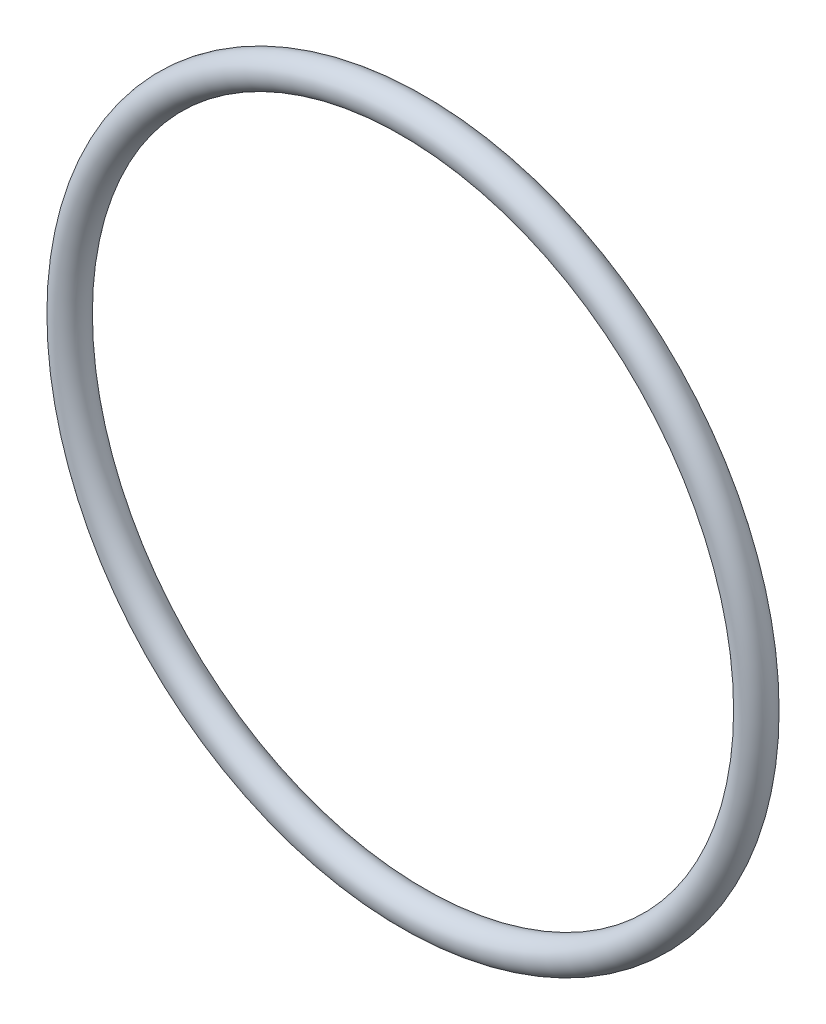
ISO-10303-21;
HEADER;
FILE_DESCRIPTION(('STEP AP214'),'2;1');
FILE_NAME('part.step','',(''),(''),'','','');
FILE_SCHEMA(('AUTOMOTIVE_DESIGN { 1 0 10303 214 1 1 1 1 }'));
ENDSEC;
DATA;
#1=APPLICATION_CONTEXT('core data for automotive mechanical design processes');
#2=APPLICATION_PROTOCOL_DEFINITION('international standard','automotive_design',2000,#1);
#3=PRODUCT_CONTEXT('',#1,'mechanical');
#4=PRODUCT('Part','Part','',(#3));
#5=PRODUCT_RELATED_PRODUCT_CATEGORY('part','',(#4));
#6=PRODUCT_DEFINITION_FORMATION('','',#4);
#7=PRODUCT_DEFINITION_CONTEXT('part definition',#1,'design');
#8=PRODUCT_DEFINITION('design','',#6,#7);
#9=PRODUCT_DEFINITION_SHAPE('','',#8);
#10=(LENGTH_UNIT() NAMED_UNIT(*) SI_UNIT(.MILLI.,.METRE.));
#11=(NAMED_UNIT(*) PLANE_ANGLE_UNIT() SI_UNIT($,.RADIAN.));
#12=(NAMED_UNIT(*) SI_UNIT($,.STERADIAN.) SOLID_ANGLE_UNIT());
#13=UNCERTAINTY_MEASURE_WITH_UNIT(LENGTH_MEASURE(1.E-05),#10,'distance_accuracy_value','');
#14=(GEOMETRIC_REPRESENTATION_CONTEXT(3) GLOBAL_UNCERTAINTY_ASSIGNED_CONTEXT((#13)) GLOBAL_UNIT_ASSIGNED_CONTEXT((#10,
#11,#12)) REPRESENTATION_CONTEXT('',''));
#15=CARTESIAN_POINT('',(0.,0.,0.));
#16=DIRECTION('',(0.,0.,1.));
#17=DIRECTION('',(1.,0.,0.));
#18=AXIS2_PLACEMENT_3D('',#15,#16,#17);
#19=CARTESIAN_POINT('',(0.,-32.5,0.));
#20=DIRECTION('',(0.,0.,-1.));
#21=DIRECTION('',(-1.,0.,0.));
#22=AXIS2_PLACEMENT_3D('',#19,#20,#21);
#23=TOROIDAL_SURFACE('',#22,32.,1.5);
#24=CARTESIAN_POINT('',(-33.5,-32.5,0.));
#25=VERTEX_POINT('',#24);
#26=VERTEX_LOOP('',#25);
#27=FACE_BOUND('',#26,.T.);
#28=ADVANCED_FACE('F34',(#27),#23,.T.);
#29=CLOSED_SHELL('',(#28));
#30=MANIFOLD_SOLID_BREP('B2',#29);
#31=ADVANCED_BREP_SHAPE_REPRESENTATION('',(#18,#30),#14);
#32=SHAPE_DEFINITION_REPRESENTATION(#9,#31);
ENDSEC;
END-ISO-10303-21;
